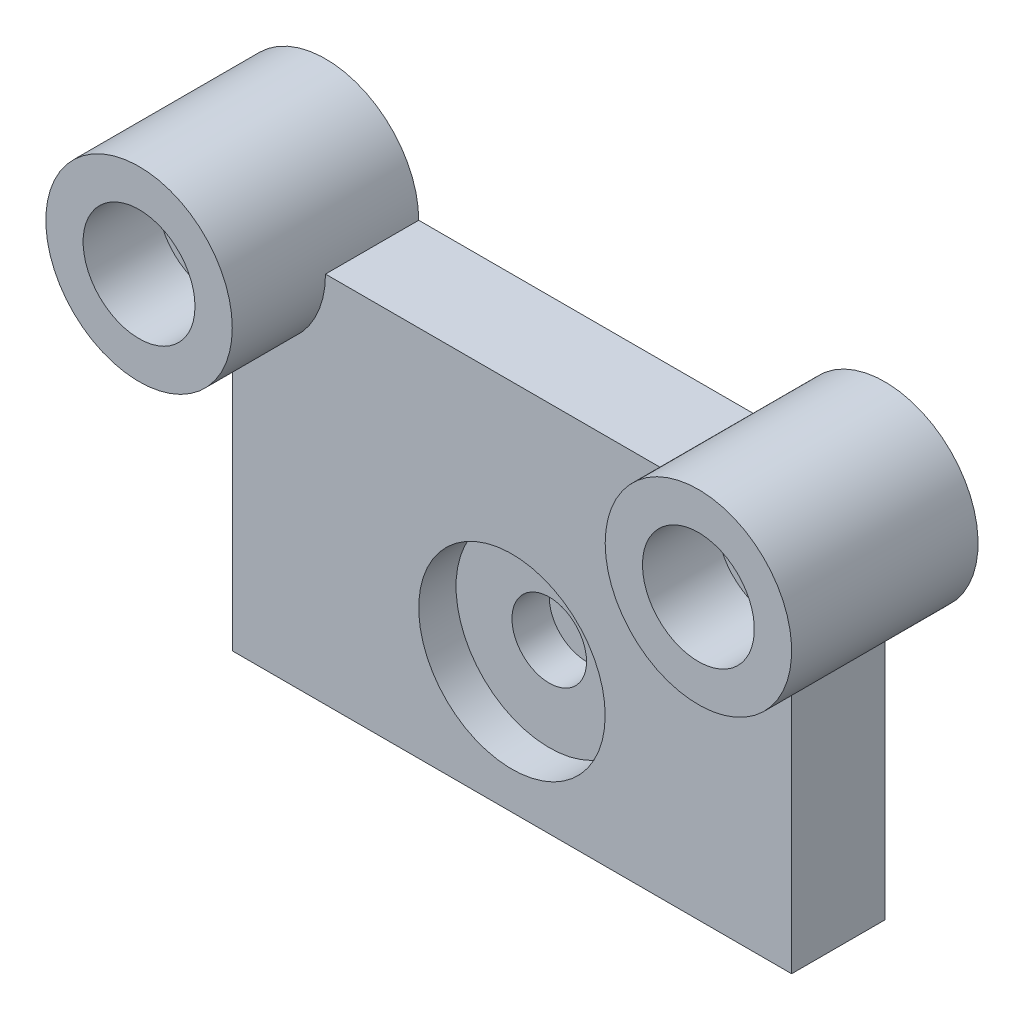
ISO-10303-21;
HEADER;
FILE_DESCRIPTION(('STEP AP214'),'2;1');
FILE_NAME('part.step','',(''),(''),'','','');
FILE_SCHEMA(('AUTOMOTIVE_DESIGN { 1 0 10303 214 1 1 1 1 }'));
ENDSEC;
DATA;
#1=APPLICATION_CONTEXT('core data for automotive mechanical design processes');
#2=APPLICATION_PROTOCOL_DEFINITION('international standard','automotive_design',2000,#1);
#3=PRODUCT_CONTEXT('',#1,'mechanical');
#4=PRODUCT('Part','Part','',(#3));
#5=PRODUCT_RELATED_PRODUCT_CATEGORY('part','',(#4));
#6=PRODUCT_DEFINITION_FORMATION('','',#4);
#7=PRODUCT_DEFINITION_CONTEXT('part definition',#1,'design');
#8=PRODUCT_DEFINITION('design','',#6,#7);
#9=PRODUCT_DEFINITION_SHAPE('','',#8);
#10=(LENGTH_UNIT() NAMED_UNIT(*) SI_UNIT(.MILLI.,.METRE.));
#11=(NAMED_UNIT(*) PLANE_ANGLE_UNIT() SI_UNIT($,.RADIAN.));
#12=(NAMED_UNIT(*) SI_UNIT($,.STERADIAN.) SOLID_ANGLE_UNIT());
#13=UNCERTAINTY_MEASURE_WITH_UNIT(LENGTH_MEASURE(1.E-05),#10,'distance_accuracy_value','');
#14=(GEOMETRIC_REPRESENTATION_CONTEXT(3) GLOBAL_UNCERTAINTY_ASSIGNED_CONTEXT((#13)) GLOBAL_UNIT_ASSIGNED_CONTEXT((#10,
#11,#12)) REPRESENTATION_CONTEXT('',''));
#15=CARTESIAN_POINT('',(0.,0.,0.));
#16=DIRECTION('',(0.,0.,1.));
#17=DIRECTION('',(1.,0.,0.));
#18=AXIS2_PLACEMENT_3D('',#15,#16,#17);
#19=CARTESIAN_POINT('',(0.,0.,25.));
#20=DIRECTION('',(0.,-1.,0.));
#21=DIRECTION('',(0.,0.,-1.));
#22=AXIS2_PLACEMENT_3D('',#19,#20,#21);
#23=PLANE('',#22);
#24=DIRECTION('',(0.,0.,-1.));
#25=VECTOR('',#24,1.);
#26=CARTESIAN_POINT('',(125.,0.,50.));
#27=LINE('',#26,#25);
#28=CARTESIAN_POINT('',(125.,0.,0.));
#29=VERTEX_POINT('',#28);
#30=CARTESIAN_POINT('',(125.,0.,25.));
#31=VERTEX_POINT('',#30);
#32=EDGE_CURVE('E48',#29,#31,#27,.F.);
#33=ORIENTED_EDGE('',*,*,#32,.F.);
#34=DIRECTION('',(-1.,0.,0.));
#35=VECTOR('',#34,1.);
#36=CARTESIAN_POINT('',(0.,0.,0.));
#37=LINE('',#36,#35);
#38=CARTESIAN_POINT('',(25.,0.,0.));
#39=VERTEX_POINT('',#38);
#40=EDGE_CURVE('E99',#29,#39,#37,.T.);
#41=ORIENTED_EDGE('',*,*,#40,.T.);
#42=DIRECTION('',(0.,0.,-1.));
#43=VECTOR('',#42,1.);
#44=CARTESIAN_POINT('',(25.,0.,50.));
#45=LINE('',#44,#43);
#46=CARTESIAN_POINT('',(25.,0.,25.));
#47=VERTEX_POINT('',#46);
#48=EDGE_CURVE('E139',#47,#39,#45,.T.);
#49=ORIENTED_EDGE('',*,*,#48,.F.);
#50=DIRECTION('',(-1.,0.,0.));
#51=VECTOR('',#50,1.);
#52=CARTESIAN_POINT('',(0.,0.,25.));
#53=LINE('',#52,#51);
#54=EDGE_CURVE('E101',#31,#47,#53,.T.);
#55=ORIENTED_EDGE('',*,*,#54,.F.);
#56=EDGE_LOOP('',(#33,#41,#49,#55));
#57=FACE_BOUND('',#56,.T.);
#58=ADVANCED_FACE('F33',(#57),#23,.F.);
#59=CARTESIAN_POINT('',(150.,0.,25.));
#60=DIRECTION('',(-1.,0.,0.));
#61=DIRECTION('',(0.,0.,1.));
#62=AXIS2_PLACEMENT_3D('',#59,#60,#61);
#63=PLANE('',#62);
#64=DIRECTION('',(0.,0.,-1.));
#65=VECTOR('',#64,1.);
#66=CARTESIAN_POINT('',(150.,-25.,50.));
#67=LINE('',#66,#65);
#68=CARTESIAN_POINT('',(150.,-25.,25.));
#69=VERTEX_POINT('',#68);
#70=CARTESIAN_POINT('',(150.,-25.,0.));
#71=VERTEX_POINT('',#70);
#72=EDGE_CURVE('E88',#69,#71,#67,.T.);
#73=ORIENTED_EDGE('',*,*,#72,.F.);
#74=DIRECTION('',(0.,1.,0.));
#75=VECTOR('',#74,1.);
#76=CARTESIAN_POINT('',(150.,0.,25.));
#77=LINE('',#76,#75);
#78=CARTESIAN_POINT('',(150.,-100.,25.));
#79=VERTEX_POINT('',#78);
#80=EDGE_CURVE('E119',#79,#69,#77,.T.);
#81=ORIENTED_EDGE('',*,*,#80,.F.);
#82=DIRECTION('',(0.,0.,-1.));
#83=VECTOR('',#82,1.);
#84=CARTESIAN_POINT('',(150.,-100.,25.));
#85=LINE('',#84,#83);
#86=CARTESIAN_POINT('',(150.,-100.,0.));
#87=VERTEX_POINT('',#86);
#88=EDGE_CURVE('E41',#79,#87,#85,.T.);
#89=ORIENTED_EDGE('',*,*,#88,.T.);
#90=DIRECTION('',(0.,1.,0.));
#91=VECTOR('',#90,1.);
#92=CARTESIAN_POINT('',(150.,0.,0.));
#93=LINE('',#92,#91);
#94=EDGE_CURVE('E108',#87,#71,#93,.T.);
#95=ORIENTED_EDGE('',*,*,#94,.T.);
#96=EDGE_LOOP('',(#73,#81,#89,#95));
#97=FACE_BOUND('',#96,.T.);
#98=ADVANCED_FACE('F132',(#97),#63,.F.);
#99=CARTESIAN_POINT('',(0.,0.,25.));
#100=DIRECTION('',(1.,0.,0.));
#101=DIRECTION('',(0.,1.,0.));
#102=AXIS2_PLACEMENT_3D('',#99,#100,#101);
#103=PLANE('',#102);
#104=DIRECTION('',(0.,0.,-1.));
#105=VECTOR('',#104,1.);
#106=CARTESIAN_POINT('',(0.,-25.,50.));
#107=LINE('',#106,#105);
#108=CARTESIAN_POINT('',(0.,-25.,0.));
#109=VERTEX_POINT('',#108);
#110=CARTESIAN_POINT('',(0.,-25.,25.));
#111=VERTEX_POINT('',#110);
#112=EDGE_CURVE('E56',#109,#111,#107,.F.);
#113=ORIENTED_EDGE('',*,*,#112,.F.);
#114=DIRECTION('',(0.,-1.,0.));
#115=VECTOR('',#114,1.);
#116=CARTESIAN_POINT('',(0.,0.,0.));
#117=LINE('',#116,#115);
#118=CARTESIAN_POINT('',(0.,-100.,0.));
#119=VERTEX_POINT('',#118);
#120=EDGE_CURVE('E126',#109,#119,#117,.T.);
#121=ORIENTED_EDGE('',*,*,#120,.T.);
#122=DIRECTION('',(0.,0.,-1.));
#123=VECTOR('',#122,1.);
#124=CARTESIAN_POINT('',(0.,-100.,25.));
#125=LINE('',#124,#123);
#126=CARTESIAN_POINT('',(0.,-100.,25.));
#127=VERTEX_POINT('',#126);
#128=EDGE_CURVE('E11',#127,#119,#125,.T.);
#129=ORIENTED_EDGE('',*,*,#128,.F.);
#130=DIRECTION('',(0.,-1.,0.));
#131=VECTOR('',#130,1.);
#132=CARTESIAN_POINT('',(0.,0.,25.));
#133=LINE('',#132,#131);
#134=EDGE_CURVE('E107',#111,#127,#133,.T.);
#135=ORIENTED_EDGE('',*,*,#134,.F.);
#136=EDGE_LOOP('',(#113,#121,#129,#135));
#137=FACE_BOUND('',#136,.T.);
#138=ADVANCED_FACE('F35',(#137),#103,.F.);
#139=CARTESIAN_POINT('',(0.,-100.,25.));
#140=DIRECTION('',(0.,1.,0.));
#141=DIRECTION('',(0.,0.,1.));
#142=AXIS2_PLACEMENT_3D('',#139,#140,#141);
#143=PLANE('',#142);
#144=DIRECTION('',(1.,0.,0.));
#145=VECTOR('',#144,1.);
#146=CARTESIAN_POINT('',(0.,-100.,0.));
#147=LINE('',#146,#145);
#148=EDGE_CURVE('E112',#119,#87,#147,.T.);
#149=ORIENTED_EDGE('',*,*,#148,.T.);
#150=ORIENTED_EDGE('',*,*,#88,.F.);
#151=DIRECTION('',(1.,0.,0.));
#152=VECTOR('',#151,1.);
#153=CARTESIAN_POINT('',(0.,-100.,25.));
#154=LINE('',#153,#152);
#155=EDGE_CURVE('E110',#127,#79,#154,.T.);
#156=ORIENTED_EDGE('',*,*,#155,.F.);
#157=ORIENTED_EDGE('',*,*,#128,.T.);
#158=EDGE_LOOP('',(#149,#150,#156,#157));
#159=FACE_BOUND('',#158,.T.);
#160=ADVANCED_FACE('F129',(#159),#143,.F.);
#161=CARTESIAN_POINT('',(0.,0.,25.));
#162=DIRECTION('',(0.,0.,1.));
#163=DIRECTION('',(1.,0.,0.));
#164=AXIS2_PLACEMENT_3D('',#161,#162,#163);
#165=PLANE('',#164);
#166=CARTESIAN_POINT('',(75.,-65.,25.));
#167=DIRECTION('',(0.,0.,1.));
#168=DIRECTION('',(1.,0.,0.));
#169=AXIS2_PLACEMENT_3D('',#166,#167,#168);
#170=CIRCLE('',#169,25.);
#171=CARTESIAN_POINT('',(100.,-65.,25.));
#172=VERTEX_POINT('',#171);
#173=EDGE_CURVE('E174',#172,#172,#170,.T.);
#174=ORIENTED_EDGE('',*,*,#173,.F.);
#175=EDGE_LOOP('',(#174));
#176=FACE_BOUND('',#175,.T.);
#177=ORIENTED_EDGE('',*,*,#80,.T.);
#178=CARTESIAN_POINT('',(150.,0.,25.));
#179=DIRECTION('',(0.,0.,1.));
#180=DIRECTION('',(1.,0.,0.));
#181=AXIS2_PLACEMENT_3D('',#178,#179,#180);
#182=CIRCLE('',#181,25.);
#183=EDGE_CURVE('E133',#69,#31,#182,.F.);
#184=ORIENTED_EDGE('',*,*,#183,.T.);
#185=ORIENTED_EDGE('',*,*,#54,.T.);
#186=CARTESIAN_POINT('',(0.,0.,25.));
#187=DIRECTION('',(0.,0.,1.));
#188=DIRECTION('',(1.,0.,0.));
#189=AXIS2_PLACEMENT_3D('',#186,#187,#188);
#190=CIRCLE('',#189,25.);
#191=EDGE_CURVE('E141',#47,#111,#190,.F.);
#192=ORIENTED_EDGE('',*,*,#191,.T.);
#193=ORIENTED_EDGE('',*,*,#134,.T.);
#194=ORIENTED_EDGE('',*,*,#155,.T.);
#195=EDGE_LOOP('',(#177,#184,#185,#192,#193,#194));
#196=FACE_BOUND('',#195,.T.);
#197=ADVANCED_FACE('F135',(#176,#196),#165,.T.);
#198=CARTESIAN_POINT('',(0.,0.,0.));
#199=DIRECTION('',(0.,0.,1.));
#200=DIRECTION('',(1.,0.,0.));
#201=AXIS2_PLACEMENT_3D('',#198,#199,#200);
#202=PLANE('',#201);
#203=ORIENTED_EDGE('',*,*,#40,.F.);
#204=CARTESIAN_POINT('',(150.,0.,0.));
#205=DIRECTION('',(0.,0.,1.));
#206=DIRECTION('',(-1.,0.,0.));
#207=AXIS2_PLACEMENT_3D('',#204,#205,#206);
#208=CIRCLE('',#207,25.);
#209=EDGE_CURVE('E85',#71,#29,#208,.T.);
#210=ORIENTED_EDGE('',*,*,#209,.F.);
#211=ORIENTED_EDGE('',*,*,#94,.F.);
#212=ORIENTED_EDGE('',*,*,#148,.F.);
#213=ORIENTED_EDGE('',*,*,#120,.F.);
#214=CARTESIAN_POINT('',(0.,0.,0.));
#215=DIRECTION('',(0.,0.,1.));
#216=DIRECTION('',(1.,0.,0.));
#217=AXIS2_PLACEMENT_3D('',#214,#215,#216);
#218=CIRCLE('',#217,25.);
#219=EDGE_CURVE('E102',#39,#109,#218,.T.);
#220=ORIENTED_EDGE('',*,*,#219,.F.);
#221=EDGE_LOOP('',(#203,#210,#211,#212,#213,#220));
#222=FACE_BOUND('',#221,.T.);
#223=ADVANCED_FACE('F105',(#222),#202,.F.);
#224=CARTESIAN_POINT('',(0.,0.,50.));
#225=DIRECTION('',(0.,0.,-1.));
#226=DIRECTION('',(-1.,0.,0.));
#227=AXIS2_PLACEMENT_3D('',#224,#225,#226);
#228=CYLINDRICAL_SURFACE('',#227,25.);
#229=CARTESIAN_POINT('',(0.,0.,50.));
#230=DIRECTION('',(0.,0.,1.));
#231=DIRECTION('',(1.,0.,0.));
#232=AXIS2_PLACEMENT_3D('',#229,#230,#231);
#233=CIRCLE('',#232,25.);
#234=CARTESIAN_POINT('',(25.,0.,50.));
#235=VERTEX_POINT('',#234);
#236=EDGE_CURVE('E143',#235,#235,#233,.T.);
#237=ORIENTED_EDGE('',*,*,#236,.F.);
#238=EDGE_LOOP('',(#237));
#239=FACE_BOUND('',#238,.T.);
#240=ORIENTED_EDGE('',*,*,#219,.T.);
#241=ORIENTED_EDGE('',*,*,#112,.T.);
#242=ORIENTED_EDGE('',*,*,#191,.F.);
#243=ORIENTED_EDGE('',*,*,#48,.T.);
#244=EDGE_LOOP('',(#240,#241,#242,#243));
#245=FACE_BOUND('',#244,.T.);
#246=ADVANCED_FACE('F213',(#239,#245),#228,.T.);
#247=CARTESIAN_POINT('',(0.,0.,50.));
#248=DIRECTION('',(0.,0.,1.));
#249=DIRECTION('',(1.,0.,0.));
#250=AXIS2_PLACEMENT_3D('',#247,#248,#249);
#251=PLANE('',#250);
#252=CARTESIAN_POINT('',(0.,0.,50.));
#253=DIRECTION('',(0.,0.,1.));
#254=DIRECTION('',(1.,0.,0.));
#255=AXIS2_PLACEMENT_3D('',#252,#253,#254);
#256=CIRCLE('',#255,15.);
#257=CARTESIAN_POINT('',(15.,0.,50.));
#258=VERTEX_POINT('',#257);
#259=EDGE_CURVE('E157',#258,#258,#256,.T.);
#260=ORIENTED_EDGE('',*,*,#259,.F.);
#261=EDGE_LOOP('',(#260));
#262=FACE_BOUND('',#261,.T.);
#263=ORIENTED_EDGE('',*,*,#236,.T.);
#264=EDGE_LOOP('',(#263));
#265=FACE_BOUND('',#264,.T.);
#266=ADVANCED_FACE('F327',(#262,#265),#251,.T.);
#267=CARTESIAN_POINT('',(150.,0.,50.));
#268=DIRECTION('',(0.,0.,-1.));
#269=DIRECTION('',(-1.,0.,0.));
#270=AXIS2_PLACEMENT_3D('',#267,#268,#269);
#271=CYLINDRICAL_SURFACE('',#270,25.);
#272=CARTESIAN_POINT('',(150.,0.,50.));
#273=DIRECTION('',(0.,0.,1.));
#274=DIRECTION('',(-1.,0.,0.));
#275=AXIS2_PLACEMENT_3D('',#272,#273,#274);
#276=CIRCLE('',#275,25.);
#277=CARTESIAN_POINT('',(125.,0.,50.));
#278=VERTEX_POINT('',#277);
#279=EDGE_CURVE('E93',#278,#278,#276,.T.);
#280=ORIENTED_EDGE('',*,*,#279,.F.);
#281=EDGE_LOOP('',(#280));
#282=FACE_BOUND('',#281,.T.);
#283=ORIENTED_EDGE('',*,*,#209,.T.);
#284=ORIENTED_EDGE('',*,*,#32,.T.);
#285=ORIENTED_EDGE('',*,*,#183,.F.);
#286=ORIENTED_EDGE('',*,*,#72,.T.);
#287=EDGE_LOOP('',(#283,#284,#285,#286));
#288=FACE_BOUND('',#287,.T.);
#289=ADVANCED_FACE('F86',(#282,#288),#271,.T.);
#290=CARTESIAN_POINT('',(150.,0.,50.));
#291=DIRECTION('',(0.,0.,-1.));
#292=DIRECTION('',(-1.,0.,0.));
#293=AXIS2_PLACEMENT_3D('',#290,#291,#292);
#294=PLANE('',#293);
#295=CARTESIAN_POINT('',(150.,0.,50.));
#296=DIRECTION('',(0.,0.,1.));
#297=DIRECTION('',(-1.,0.,0.));
#298=AXIS2_PLACEMENT_3D('',#295,#296,#297);
#299=CIRCLE('',#298,15.);
#300=CARTESIAN_POINT('',(135.,0.,50.));
#301=VERTEX_POINT('',#300);
#302=EDGE_CURVE('E150',#301,#301,#299,.T.);
#303=ORIENTED_EDGE('',*,*,#302,.F.);
#304=EDGE_LOOP('',(#303));
#305=FACE_BOUND('',#304,.T.);
#306=ORIENTED_EDGE('',*,*,#279,.T.);
#307=EDGE_LOOP('',(#306));
#308=FACE_BOUND('',#307,.T.);
#309=ADVANCED_FACE('F320',(#305,#308),#294,.F.);
#310=CARTESIAN_POINT('',(150.,0.,30.));
#311=DIRECTION('',(0.,0.,1.));
#312=DIRECTION('',(1.,0.,0.));
#313=AXIS2_PLACEMENT_3D('',#310,#311,#312);
#314=CYLINDRICAL_SURFACE('',#313,15.);
#315=CARTESIAN_POINT('',(150.,0.,30.));
#316=DIRECTION('',(0.,0.,1.));
#317=DIRECTION('',(-1.,0.,0.));
#318=AXIS2_PLACEMENT_3D('',#315,#316,#317);
#319=CIRCLE('',#318,15.);
#320=CARTESIAN_POINT('',(135.,0.,30.));
#321=VERTEX_POINT('',#320);
#322=EDGE_CURVE('E153',#321,#321,#319,.T.);
#323=ORIENTED_EDGE('',*,*,#322,.F.);
#324=EDGE_LOOP('',(#323));
#325=FACE_BOUND('',#324,.T.);
#326=ORIENTED_EDGE('',*,*,#302,.T.);
#327=EDGE_LOOP('',(#326));
#328=FACE_BOUND('',#327,.T.);
#329=ADVANCED_FACE('F316',(#325,#328),#314,.F.);
#330=CARTESIAN_POINT('',(150.,0.,30.));
#331=DIRECTION('',(0.,0.,-1.));
#332=DIRECTION('',(-1.,0.,0.));
#333=AXIS2_PLACEMENT_3D('',#330,#331,#332);
#334=PLANE('',#333);
#335=CARTESIAN_POINT('',(150.,0.,30.));
#336=DIRECTION('',(0.,0.,1.));
#337=DIRECTION('',(-1.,0.,0.));
#338=AXIS2_PLACEMENT_3D('',#335,#336,#337);
#339=CIRCLE('',#338,7.49999999999999);
#340=CARTESIAN_POINT('',(142.5,0.,30.));
#341=VERTEX_POINT('',#340);
#342=EDGE_CURVE('E162',#341,#341,#339,.T.);
#343=ORIENTED_EDGE('',*,*,#342,.F.);
#344=EDGE_LOOP('',(#343));
#345=FACE_BOUND('',#344,.T.);
#346=ORIENTED_EDGE('',*,*,#322,.T.);
#347=EDGE_LOOP('',(#346));
#348=FACE_BOUND('',#347,.T.);
#349=ADVANCED_FACE('F312',(#345,#348),#334,.F.);
#350=CARTESIAN_POINT('',(0.,0.,30.));
#351=DIRECTION('',(0.,0.,1.));
#352=DIRECTION('',(1.,0.,0.));
#353=AXIS2_PLACEMENT_3D('',#350,#351,#352);
#354=CYLINDRICAL_SURFACE('',#353,15.);
#355=CARTESIAN_POINT('',(0.,0.,30.));
#356=DIRECTION('',(0.,0.,1.));
#357=DIRECTION('',(1.,0.,0.));
#358=AXIS2_PLACEMENT_3D('',#355,#356,#357);
#359=CIRCLE('',#358,15.);
#360=CARTESIAN_POINT('',(15.,0.,30.));
#361=VERTEX_POINT('',#360);
#362=EDGE_CURVE('E94',#361,#361,#359,.T.);
#363=ORIENTED_EDGE('',*,*,#362,.F.);
#364=EDGE_LOOP('',(#363));
#365=FACE_BOUND('',#364,.T.);
#366=ORIENTED_EDGE('',*,*,#259,.T.);
#367=EDGE_LOOP('',(#366));
#368=FACE_BOUND('',#367,.T.);
#369=ADVANCED_FACE('F308',(#365,#368),#354,.F.);
#370=CARTESIAN_POINT('',(0.,0.,30.));
#371=DIRECTION('',(0.,0.,1.));
#372=DIRECTION('',(1.,0.,0.));
#373=AXIS2_PLACEMENT_3D('',#370,#371,#372);
#374=PLANE('',#373);
#375=CARTESIAN_POINT('',(0.,0.,30.));
#376=DIRECTION('',(0.,0.,1.));
#377=DIRECTION('',(1.,0.,0.));
#378=AXIS2_PLACEMENT_3D('',#375,#376,#377);
#379=CIRCLE('',#378,7.5);
#380=CARTESIAN_POINT('',(7.5,0.,30.));
#381=VERTEX_POINT('',#380);
#382=EDGE_CURVE('E169',#381,#381,#379,.T.);
#383=ORIENTED_EDGE('',*,*,#382,.F.);
#384=EDGE_LOOP('',(#383));
#385=FACE_BOUND('',#384,.T.);
#386=ORIENTED_EDGE('',*,*,#362,.T.);
#387=EDGE_LOOP('',(#386));
#388=FACE_BOUND('',#387,.T.);
#389=ADVANCED_FACE('F299',(#385,#388),#374,.T.);
#390=CARTESIAN_POINT('',(0.,0.,15.));
#391=DIRECTION('',(0.,0.,1.));
#392=DIRECTION('',(1.,0.,0.));
#393=AXIS2_PLACEMENT_3D('',#390,#391,#392);
#394=CYLINDRICAL_SURFACE('',#393,7.5);
#395=CARTESIAN_POINT('',(0.,0.,15.));
#396=DIRECTION('',(0.,0.,1.));
#397=DIRECTION('',(1.,0.,0.));
#398=AXIS2_PLACEMENT_3D('',#395,#396,#397);
#399=CIRCLE('',#398,7.5);
#400=CARTESIAN_POINT('',(7.5,0.,15.));
#401=VERTEX_POINT('',#400);
#402=EDGE_CURVE('E154',#401,#401,#399,.T.);
#403=ORIENTED_EDGE('',*,*,#402,.F.);
#404=EDGE_LOOP('',(#403));
#405=FACE_BOUND('',#404,.T.);
#406=ORIENTED_EDGE('',*,*,#382,.T.);
#407=EDGE_LOOP('',(#406));
#408=FACE_BOUND('',#407,.T.);
#409=ADVANCED_FACE('F295',(#405,#408),#394,.F.);
#410=CARTESIAN_POINT('',(0.,0.,15.));
#411=DIRECTION('',(0.,0.,1.));
#412=DIRECTION('',(1.,0.,0.));
#413=AXIS2_PLACEMENT_3D('',#410,#411,#412);
#414=PLANE('',#413);
#415=ORIENTED_EDGE('',*,*,#402,.T.);
#416=EDGE_LOOP('',(#415));
#417=FACE_BOUND('',#416,.T.);
#418=ADVANCED_FACE('F291',(#417),#414,.T.);
#419=CARTESIAN_POINT('',(150.,0.,15.));
#420=DIRECTION('',(0.,0.,1.));
#421=DIRECTION('',(1.,0.,0.));
#422=AXIS2_PLACEMENT_3D('',#419,#420,#421);
#423=CYLINDRICAL_SURFACE('',#422,7.49999999999999);
#424=CARTESIAN_POINT('',(150.,0.,15.));
#425=DIRECTION('',(0.,0.,1.));
#426=DIRECTION('',(-1.,0.,0.));
#427=AXIS2_PLACEMENT_3D('',#424,#425,#426);
#428=CIRCLE('',#427,7.49999999999999);
#429=CARTESIAN_POINT('',(142.5,0.,15.));
#430=VERTEX_POINT('',#429);
#431=EDGE_CURVE('E165',#430,#430,#428,.T.);
#432=ORIENTED_EDGE('',*,*,#431,.F.);
#433=EDGE_LOOP('',(#432));
#434=FACE_BOUND('',#433,.T.);
#435=ORIENTED_EDGE('',*,*,#342,.T.);
#436=EDGE_LOOP('',(#435));
#437=FACE_BOUND('',#436,.T.);
#438=ADVANCED_FACE('F294',(#434,#437),#423,.F.);
#439=CARTESIAN_POINT('',(150.,0.,15.));
#440=DIRECTION('',(0.,0.,-1.));
#441=DIRECTION('',(-1.,0.,0.));
#442=AXIS2_PLACEMENT_3D('',#439,#440,#441);
#443=PLANE('',#442);
#444=ORIENTED_EDGE('',*,*,#431,.T.);
#445=EDGE_LOOP('',(#444));
#446=FACE_BOUND('',#445,.T.);
#447=ADVANCED_FACE('F203',(#446),#443,.F.);
#448=CARTESIAN_POINT('',(75.,-65.,15.));
#449=DIRECTION('',(0.,0.,1.));
#450=DIRECTION('',(1.,0.,0.));
#451=AXIS2_PLACEMENT_3D('',#448,#449,#450);
#452=CYLINDRICAL_SURFACE('',#451,25.);
#453=CARTESIAN_POINT('',(75.,-65.,15.));
#454=DIRECTION('',(0.,0.,1.));
#455=DIRECTION('',(1.,0.,0.));
#456=AXIS2_PLACEMENT_3D('',#453,#454,#455);
#457=CIRCLE('',#456,25.);
#458=CARTESIAN_POINT('',(100.,-65.,15.));
#459=VERTEX_POINT('',#458);
#460=EDGE_CURVE('E166',#459,#459,#457,.T.);
#461=ORIENTED_EDGE('',*,*,#460,.F.);
#462=EDGE_LOOP('',(#461));
#463=FACE_BOUND('',#462,.T.);
#464=ORIENTED_EDGE('',*,*,#173,.T.);
#465=EDGE_LOOP('',(#464));
#466=FACE_BOUND('',#465,.T.);
#467=ADVANCED_FACE('F197',(#463,#466),#452,.F.);
#468=CARTESIAN_POINT('',(0.,0.,15.));
#469=DIRECTION('',(0.,0.,1.));
#470=DIRECTION('',(1.,0.,0.));
#471=AXIS2_PLACEMENT_3D('',#468,#469,#470);
#472=PLANE('',#471);
#473=CARTESIAN_POINT('',(75.,-65.,15.));
#474=DIRECTION('',(0.,0.,1.));
#475=DIRECTION('',(1.,0.,0.));
#476=AXIS2_PLACEMENT_3D('',#473,#474,#475);
#477=CIRCLE('',#476,9.99999999999999);
#478=CARTESIAN_POINT('',(85.,-65.,15.));
#479=VERTEX_POINT('',#478);
#480=EDGE_CURVE('E180',#479,#479,#477,.T.);
#481=ORIENTED_EDGE('',*,*,#480,.F.);
#482=EDGE_LOOP('',(#481));
#483=FACE_BOUND('',#482,.T.);
#484=ORIENTED_EDGE('',*,*,#460,.T.);
#485=EDGE_LOOP('',(#484));
#486=FACE_BOUND('',#485,.T.);
#487=ADVANCED_FACE('F191',(#483,#486),#472,.T.);
#488=CARTESIAN_POINT('',(75.,-65.,5.));
#489=DIRECTION('',(0.,0.,1.));
#490=DIRECTION('',(1.,0.,0.));
#491=AXIS2_PLACEMENT_3D('',#488,#489,#490);
#492=CYLINDRICAL_SURFACE('',#491,9.99999999999999);
#493=CARTESIAN_POINT('',(75.,-65.,5.));
#494=DIRECTION('',(0.,0.,1.));
#495=DIRECTION('',(1.,0.,0.));
#496=AXIS2_PLACEMENT_3D('',#493,#494,#495);
#497=CIRCLE('',#496,9.99999999999999);
#498=CARTESIAN_POINT('',(85.,-65.,5.));
#499=VERTEX_POINT('',#498);
#500=EDGE_CURVE('E177',#499,#499,#497,.T.);
#501=ORIENTED_EDGE('',*,*,#500,.F.);
#502=EDGE_LOOP('',(#501));
#503=FACE_BOUND('',#502,.T.);
#504=ORIENTED_EDGE('',*,*,#480,.T.);
#505=EDGE_LOOP('',(#504));
#506=FACE_BOUND('',#505,.T.);
#507=ADVANCED_FACE('F188',(#503,#506),#492,.F.);
#508=CARTESIAN_POINT('',(75.,-65.,5.));
#509=DIRECTION('',(0.,0.,1.));
#510=DIRECTION('',(1.,0.,0.));
#511=AXIS2_PLACEMENT_3D('',#508,#509,#510);
#512=PLANE('',#511);
#513=ORIENTED_EDGE('',*,*,#500,.T.);
#514=EDGE_LOOP('',(#513));
#515=FACE_BOUND('',#514,.T.);
#516=ADVANCED_FACE('F186',(#515),#512,.T.);
#517=CLOSED_SHELL('',(#58,#98,#138,#160,#197,#223,#246,#266,#289,#309,#329,#349,#369,#389,#409,
#418,#438,#447,#467,#487,#507,#516));
#518=MANIFOLD_SOLID_BREP('B2',#517);
#519=ADVANCED_BREP_SHAPE_REPRESENTATION('',(#18,#518),#14);
#520=SHAPE_DEFINITION_REPRESENTATION(#9,#519);
ENDSEC;
END-ISO-10303-21;
